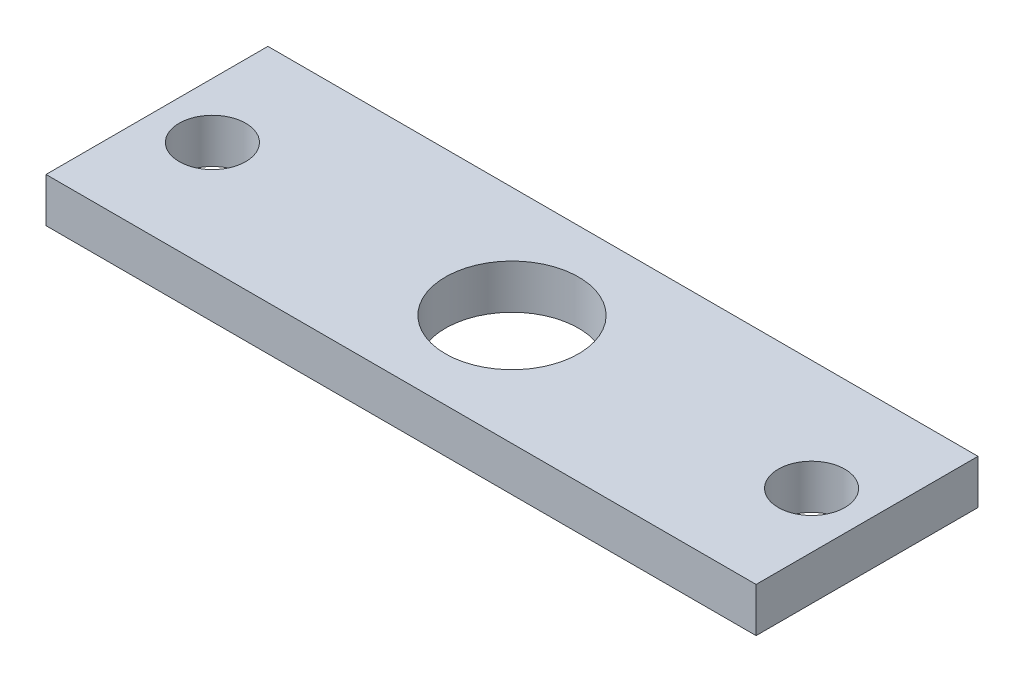
ISO-10303-21;
HEADER;
FILE_DESCRIPTION(('STEP AP214'),'2;1');
FILE_NAME('part.step','',(''),(''),'','','');
FILE_SCHEMA(('AUTOMOTIVE_DESIGN { 1 0 10303 214 1 1 1 1 }'));
ENDSEC;
DATA;
#1=APPLICATION_CONTEXT('core data for automotive mechanical design processes');
#2=APPLICATION_PROTOCOL_DEFINITION('international standard','automotive_design',2000,#1);
#3=PRODUCT_CONTEXT('',#1,'mechanical');
#4=PRODUCT('Part','Part','',(#3));
#5=PRODUCT_RELATED_PRODUCT_CATEGORY('part','',(#4));
#6=PRODUCT_DEFINITION_FORMATION('','',#4);
#7=PRODUCT_DEFINITION_CONTEXT('part definition',#1,'design');
#8=PRODUCT_DEFINITION('design','',#6,#7);
#9=PRODUCT_DEFINITION_SHAPE('','',#8);
#10=(LENGTH_UNIT() NAMED_UNIT(*) SI_UNIT(.MILLI.,.METRE.));
#11=(NAMED_UNIT(*) PLANE_ANGLE_UNIT() SI_UNIT($,.RADIAN.));
#12=(NAMED_UNIT(*) SI_UNIT($,.STERADIAN.) SOLID_ANGLE_UNIT());
#13=UNCERTAINTY_MEASURE_WITH_UNIT(LENGTH_MEASURE(1.E-05),#10,'distance_accuracy_value','');
#14=(GEOMETRIC_REPRESENTATION_CONTEXT(3) GLOBAL_UNCERTAINTY_ASSIGNED_CONTEXT((#13)) GLOBAL_UNIT_ASSIGNED_CONTEXT((#10,
#11,#12)) REPRESENTATION_CONTEXT('',''));
#15=CARTESIAN_POINT('',(0.,0.,0.));
#16=DIRECTION('',(0.,0.,1.));
#17=DIRECTION('',(1.,0.,0.));
#18=AXIS2_PLACEMENT_3D('',#15,#16,#17);
#19=CARTESIAN_POINT('',(-25.3333333333333,2.,-5.13157894736842));
#20=DIRECTION('',(1.,0.,0.));
#21=DIRECTION('',(0.,0.,-1.));
#22=AXIS2_PLACEMENT_3D('',#19,#20,#21);
#23=PLANE('',#22);
#24=DIRECTION('',(0.,0.,1.));
#25=VECTOR('',#24,1.);
#26=CARTESIAN_POINT('',(-25.3333333333333,0.,-5.13157894736842));
#27=LINE('',#26,#25);
#28=CARTESIAN_POINT('',(-25.3333333333333,0.,-5.13157894736842));
#29=VERTEX_POINT('',#28);
#30=CARTESIAN_POINT('',(-25.3333333333333,0.,4.86842105263158));
#31=VERTEX_POINT('',#30);
#32=EDGE_CURVE('E96',#29,#31,#27,.T.);
#33=ORIENTED_EDGE('',*,*,#32,.T.);
#34=DIRECTION('',(0.,-1.,0.));
#35=VECTOR('',#34,1.);
#36=CARTESIAN_POINT('',(-25.3333333333333,2.,4.86842105263158));
#37=LINE('',#36,#35);
#38=CARTESIAN_POINT('',(-25.3333333333333,2.,4.86842105263158));
#39=VERTEX_POINT('',#38);
#40=EDGE_CURVE('E11',#39,#31,#37,.T.);
#41=ORIENTED_EDGE('',*,*,#40,.F.);
#42=DIRECTION('',(0.,0.,1.));
#43=VECTOR('',#42,1.);
#44=CARTESIAN_POINT('',(-25.3333333333333,2.,-5.13157894736842));
#45=LINE('',#44,#43);
#46=CARTESIAN_POINT('',(-25.3333333333333,2.,-5.13157894736842));
#47=VERTEX_POINT('',#46);
#48=EDGE_CURVE('E84',#47,#39,#45,.T.);
#49=ORIENTED_EDGE('',*,*,#48,.F.);
#50=DIRECTION('',(0.,-1.,0.));
#51=VECTOR('',#50,1.);
#52=CARTESIAN_POINT('',(-25.3333333333333,2.,-5.13157894736842));
#53=LINE('',#52,#51);
#54=EDGE_CURVE('E92',#47,#29,#53,.T.);
#55=ORIENTED_EDGE('',*,*,#54,.T.);
#56=EDGE_LOOP('',(#33,#41,#49,#55));
#57=FACE_BOUND('',#56,.T.);
#58=ADVANCED_FACE('F33',(#57),#23,.F.);
#59=CARTESIAN_POINT('',(-25.3333333333333,2.,4.86842105263158));
#60=DIRECTION('',(0.,0.,-1.));
#61=DIRECTION('',(-1.,0.,0.));
#62=AXIS2_PLACEMENT_3D('',#59,#60,#61);
#63=PLANE('',#62);
#64=DIRECTION('',(1.,0.,0.));
#65=VECTOR('',#64,1.);
#66=CARTESIAN_POINT('',(-25.3333333333333,0.,4.86842105263158));
#67=LINE('',#66,#65);
#68=CARTESIAN_POINT('',(6.66666666666668,0.,4.86842105263158));
#69=VERTEX_POINT('',#68);
#70=EDGE_CURVE('E88',#31,#69,#67,.T.);
#71=ORIENTED_EDGE('',*,*,#70,.T.);
#72=DIRECTION('',(0.,-1.,0.));
#73=VECTOR('',#72,1.);
#74=CARTESIAN_POINT('',(6.66666666666668,2.,4.86842105263158));
#75=LINE('',#74,#73);
#76=CARTESIAN_POINT('',(6.66666666666668,2.,4.86842105263158));
#77=VERTEX_POINT('',#76);
#78=EDGE_CURVE('E41',#77,#69,#75,.T.);
#79=ORIENTED_EDGE('',*,*,#78,.F.);
#80=DIRECTION('',(1.,0.,0.));
#81=VECTOR('',#80,1.);
#82=CARTESIAN_POINT('',(-25.3333333333333,2.,4.86842105263158));
#83=LINE('',#82,#81);
#84=EDGE_CURVE('E79',#39,#77,#83,.T.);
#85=ORIENTED_EDGE('',*,*,#84,.F.);
#86=ORIENTED_EDGE('',*,*,#40,.T.);
#87=EDGE_LOOP('',(#71,#79,#85,#86));
#88=FACE_BOUND('',#87,.T.);
#89=ADVANCED_FACE('F87',(#88),#63,.F.);
#90=CARTESIAN_POINT('',(6.66666666666668,2.,-5.13157894736842));
#91=DIRECTION('',(-1.,0.,0.));
#92=DIRECTION('',(0.,0.,1.));
#93=AXIS2_PLACEMENT_3D('',#90,#91,#92);
#94=PLANE('',#93);
#95=DIRECTION('',(0.,0.,-1.));
#96=VECTOR('',#95,1.);
#97=CARTESIAN_POINT('',(6.66666666666668,0.,-5.13157894736842));
#98=LINE('',#97,#96);
#99=CARTESIAN_POINT('',(6.66666666666668,0.,-5.13157894736842));
#100=VERTEX_POINT('',#99);
#101=EDGE_CURVE('E66',#69,#100,#98,.T.);
#102=ORIENTED_EDGE('',*,*,#101,.T.);
#103=DIRECTION('',(0.,-1.,0.));
#104=VECTOR('',#103,1.);
#105=CARTESIAN_POINT('',(6.66666666666668,2.,-5.13157894736842));
#106=LINE('',#105,#104);
#107=CARTESIAN_POINT('',(6.66666666666668,2.,-5.13157894736842));
#108=VERTEX_POINT('',#107);
#109=EDGE_CURVE('E89',#108,#100,#106,.T.);
#110=ORIENTED_EDGE('',*,*,#109,.F.);
#111=DIRECTION('',(0.,0.,-1.));
#112=VECTOR('',#111,1.);
#113=CARTESIAN_POINT('',(6.66666666666668,2.,-5.13157894736842));
#114=LINE('',#113,#112);
#115=EDGE_CURVE('E82',#77,#108,#114,.T.);
#116=ORIENTED_EDGE('',*,*,#115,.F.);
#117=ORIENTED_EDGE('',*,*,#78,.T.);
#118=EDGE_LOOP('',(#102,#110,#116,#117));
#119=FACE_BOUND('',#118,.T.);
#120=ADVANCED_FACE('F90',(#119),#94,.F.);
#121=CARTESIAN_POINT('',(-25.3333333333333,2.,-5.13157894736842));
#122=DIRECTION('',(0.,0.,1.));
#123=DIRECTION('',(1.,0.,0.));
#124=AXIS2_PLACEMENT_3D('',#121,#122,#123);
#125=PLANE('',#124);
#126=DIRECTION('',(-1.,0.,0.));
#127=VECTOR('',#126,1.);
#128=CARTESIAN_POINT('',(-25.3333333333333,0.,-5.13157894736842));
#129=LINE('',#128,#127);
#130=EDGE_CURVE('E72',#100,#29,#129,.T.);
#131=ORIENTED_EDGE('',*,*,#130,.T.);
#132=ORIENTED_EDGE('',*,*,#54,.F.);
#133=DIRECTION('',(-1.,0.,0.));
#134=VECTOR('',#133,1.);
#135=CARTESIAN_POINT('',(-25.3333333333333,2.,-5.13157894736842));
#136=LINE('',#135,#134);
#137=EDGE_CURVE('E49',#108,#47,#136,.T.);
#138=ORIENTED_EDGE('',*,*,#137,.F.);
#139=ORIENTED_EDGE('',*,*,#109,.T.);
#140=EDGE_LOOP('',(#131,#132,#138,#139));
#141=FACE_BOUND('',#140,.T.);
#142=ADVANCED_FACE('F104',(#141),#125,.F.);
#143=CARTESIAN_POINT('',(0.,2.,0.));
#144=DIRECTION('',(0.,1.,0.));
#145=DIRECTION('',(0.,0.,1.));
#146=AXIS2_PLACEMENT_3D('',#143,#144,#145);
#147=PLANE('',#146);
#148=CARTESIAN_POINT('',(-22.8333333333333,2.,-0.131578947368416));
#149=DIRECTION('',(0.,1.,0.));
#150=DIRECTION('',(0.,0.,1.));
#151=AXIS2_PLACEMENT_3D('',#148,#149,#150);
#152=CIRCLE('',#151,1.5);
#153=CARTESIAN_POINT('',(-22.8333333333333,2.,1.36842105263158));
#154=VERTEX_POINT('',#153);
#155=EDGE_CURVE('E122',#154,#154,#152,.T.);
#156=ORIENTED_EDGE('',*,*,#155,.F.);
#157=EDGE_LOOP('',(#156));
#158=FACE_BOUND('',#157,.T.);
#159=CARTESIAN_POINT('',(4.16666666666668,2.,-0.131578947368416));
#160=DIRECTION('',(0.,1.,0.));
#161=DIRECTION('',(0.,0.,1.));
#162=AXIS2_PLACEMENT_3D('',#159,#160,#161);
#163=CIRCLE('',#162,1.5);
#164=CARTESIAN_POINT('',(4.16666666666668,2.,1.36842105263158));
#165=VERTEX_POINT('',#164);
#166=EDGE_CURVE('E116',#165,#165,#163,.T.);
#167=ORIENTED_EDGE('',*,*,#166,.F.);
#168=EDGE_LOOP('',(#167));
#169=FACE_BOUND('',#168,.T.);
#170=CARTESIAN_POINT('',(-9.33333333333332,2.,-0.131578947368416));
#171=DIRECTION('',(0.,1.,0.));
#172=DIRECTION('',(0.,0.,1.));
#173=AXIS2_PLACEMENT_3D('',#170,#171,#172);
#174=CIRCLE('',#173,3.);
#175=CARTESIAN_POINT('',(-9.33333333333332,2.,2.86842105263158));
#176=VERTEX_POINT('',#175);
#177=EDGE_CURVE('E110',#176,#176,#174,.T.);
#178=ORIENTED_EDGE('',*,*,#177,.F.);
#179=EDGE_LOOP('',(#178));
#180=FACE_BOUND('',#179,.T.);
#181=ORIENTED_EDGE('',*,*,#48,.T.);
#182=ORIENTED_EDGE('',*,*,#84,.T.);
#183=ORIENTED_EDGE('',*,*,#115,.T.);
#184=ORIENTED_EDGE('',*,*,#137,.T.);
#185=EDGE_LOOP('',(#181,#182,#183,#184));
#186=FACE_BOUND('',#185,.T.);
#187=ADVANCED_FACE('F80',(#158,#169,#180,#186),#147,.T.);
#188=CARTESIAN_POINT('',(0.,0.,0.));
#189=DIRECTION('',(0.,1.,0.));
#190=DIRECTION('',(0.,0.,1.));
#191=AXIS2_PLACEMENT_3D('',#188,#189,#190);
#192=PLANE('',#191);
#193=CARTESIAN_POINT('',(-22.8333333333333,0.,-0.131578947368416));
#194=DIRECTION('',(0.,1.,0.));
#195=DIRECTION('',(0.,0.,1.));
#196=AXIS2_PLACEMENT_3D('',#193,#194,#195);
#197=CIRCLE('',#196,1.5);
#198=CARTESIAN_POINT('',(-22.8333333333333,0.,1.36842105263158));
#199=VERTEX_POINT('',#198);
#200=EDGE_CURVE('E99',#199,#199,#197,.T.);
#201=ORIENTED_EDGE('',*,*,#200,.T.);
#202=EDGE_LOOP('',(#201));
#203=FACE_BOUND('',#202,.T.);
#204=CARTESIAN_POINT('',(4.16666666666668,0.,-0.131578947368416));
#205=DIRECTION('',(0.,1.,0.));
#206=DIRECTION('',(0.,0.,1.));
#207=AXIS2_PLACEMENT_3D('',#204,#205,#206);
#208=CIRCLE('',#207,1.5);
#209=CARTESIAN_POINT('',(4.16666666666668,0.,1.36842105263158));
#210=VERTEX_POINT('',#209);
#211=EDGE_CURVE('E119',#210,#210,#208,.T.);
#212=ORIENTED_EDGE('',*,*,#211,.T.);
#213=EDGE_LOOP('',(#212));
#214=FACE_BOUND('',#213,.T.);
#215=CARTESIAN_POINT('',(-9.33333333333332,0.,-0.131578947368416));
#216=DIRECTION('',(0.,1.,0.));
#217=DIRECTION('',(0.,0.,1.));
#218=AXIS2_PLACEMENT_3D('',#215,#216,#217);
#219=CIRCLE('',#218,3.);
#220=CARTESIAN_POINT('',(-9.33333333333332,0.,2.86842105263158));
#221=VERTEX_POINT('',#220);
#222=EDGE_CURVE('E113',#221,#221,#219,.T.);
#223=ORIENTED_EDGE('',*,*,#222,.T.);
#224=EDGE_LOOP('',(#223));
#225=FACE_BOUND('',#224,.T.);
#226=ORIENTED_EDGE('',*,*,#32,.F.);
#227=ORIENTED_EDGE('',*,*,#130,.F.);
#228=ORIENTED_EDGE('',*,*,#101,.F.);
#229=ORIENTED_EDGE('',*,*,#70,.F.);
#230=EDGE_LOOP('',(#226,#227,#228,#229));
#231=FACE_BOUND('',#230,.T.);
#232=ADVANCED_FACE('F107',(#203,#214,#225,#231),#192,.F.);
#233=CARTESIAN_POINT('',(-9.33333333333332,0.,-0.131578947368416));
#234=DIRECTION('',(0.,1.,0.));
#235=DIRECTION('',(0.,0.,1.));
#236=AXIS2_PLACEMENT_3D('',#233,#234,#235);
#237=CYLINDRICAL_SURFACE('',#236,3.);
#238=ORIENTED_EDGE('',*,*,#222,.F.);
#239=EDGE_LOOP('',(#238));
#240=FACE_BOUND('',#239,.T.);
#241=ORIENTED_EDGE('',*,*,#177,.T.);
#242=EDGE_LOOP('',(#241));
#243=FACE_BOUND('',#242,.T.);
#244=ADVANCED_FACE('F144',(#240,#243),#237,.F.);
#245=CARTESIAN_POINT('',(4.16666666666668,0.,-0.131578947368416));
#246=DIRECTION('',(0.,1.,0.));
#247=DIRECTION('',(0.,0.,1.));
#248=AXIS2_PLACEMENT_3D('',#245,#246,#247);
#249=CYLINDRICAL_SURFACE('',#248,1.5);
#250=ORIENTED_EDGE('',*,*,#211,.F.);
#251=EDGE_LOOP('',(#250));
#252=FACE_BOUND('',#251,.T.);
#253=ORIENTED_EDGE('',*,*,#166,.T.);
#254=EDGE_LOOP('',(#253));
#255=FACE_BOUND('',#254,.T.);
#256=ADVANCED_FACE('F133',(#252,#255),#249,.F.);
#257=CARTESIAN_POINT('',(-22.8333333333333,0.,-0.131578947368416));
#258=DIRECTION('',(0.,1.,0.));
#259=DIRECTION('',(0.,0.,1.));
#260=AXIS2_PLACEMENT_3D('',#257,#258,#259);
#261=CYLINDRICAL_SURFACE('',#260,1.5);
#262=ORIENTED_EDGE('',*,*,#200,.F.);
#263=EDGE_LOOP('',(#262));
#264=FACE_BOUND('',#263,.T.);
#265=ORIENTED_EDGE('',*,*,#155,.T.);
#266=EDGE_LOOP('',(#265));
#267=FACE_BOUND('',#266,.T.);
#268=ADVANCED_FACE('F130',(#264,#267),#261,.F.);
#269=CLOSED_SHELL('',(#58,#89,#120,#142,#187,#232,#244,#256,#268));
#270=MANIFOLD_SOLID_BREP('B2',#269);
#271=ADVANCED_BREP_SHAPE_REPRESENTATION('',(#18,#270),#14);
#272=SHAPE_DEFINITION_REPRESENTATION(#9,#271);
ENDSEC;
END-ISO-10303-21;
